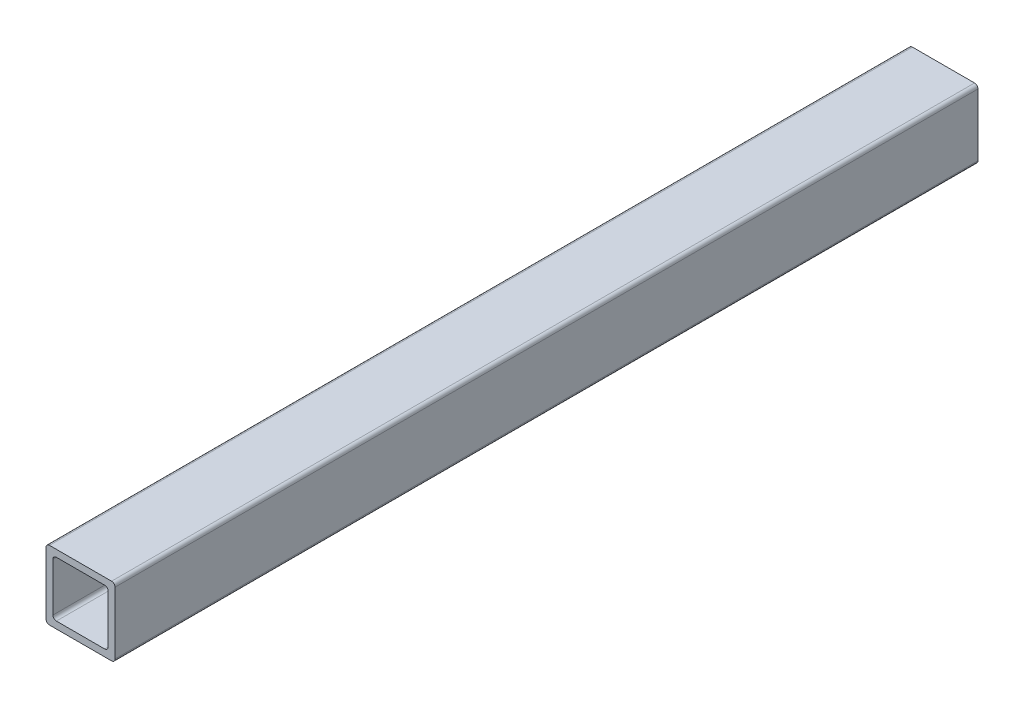
ISO-10303-21;
HEADER;
FILE_DESCRIPTION(('STEP AP214'),'2;1');
FILE_NAME('part.step','',(''),(''),'','','');
FILE_SCHEMA(('AUTOMOTIVE_DESIGN { 1 0 10303 214 1 1 1 1 }'));
ENDSEC;
DATA;
#1=APPLICATION_CONTEXT('core data for automotive mechanical design processes');
#2=APPLICATION_PROTOCOL_DEFINITION('international standard','automotive_design',2000,#1);
#3=PRODUCT_CONTEXT('',#1,'mechanical');
#4=PRODUCT('Part','Part','',(#3));
#5=PRODUCT_RELATED_PRODUCT_CATEGORY('part','',(#4));
#6=PRODUCT_DEFINITION_FORMATION('','',#4);
#7=PRODUCT_DEFINITION_CONTEXT('part definition',#1,'design');
#8=PRODUCT_DEFINITION('design','',#6,#7);
#9=PRODUCT_DEFINITION_SHAPE('','',#8);
#10=(LENGTH_UNIT() NAMED_UNIT(*) SI_UNIT(.MILLI.,.METRE.));
#11=(NAMED_UNIT(*) PLANE_ANGLE_UNIT() SI_UNIT($,.RADIAN.));
#12=(NAMED_UNIT(*) SI_UNIT($,.STERADIAN.) SOLID_ANGLE_UNIT());
#13=UNCERTAINTY_MEASURE_WITH_UNIT(LENGTH_MEASURE(1.E-05),#10,'distance_accuracy_value','');
#14=(GEOMETRIC_REPRESENTATION_CONTEXT(3) GLOBAL_UNCERTAINTY_ASSIGNED_CONTEXT((#13)) GLOBAL_UNIT_ASSIGNED_CONTEXT((#10,
#11,#12)) REPRESENTATION_CONTEXT('',''));
#15=CARTESIAN_POINT('',(0.,0.,0.));
#16=DIRECTION('',(0.,0.,1.));
#17=DIRECTION('',(1.,0.,0.));
#18=AXIS2_PLACEMENT_3D('',#15,#16,#17);
#19=CARTESIAN_POINT('',(2.,2.,499.999999999999));
#20=DIRECTION('',(0.,0.,-1.));
#21=DIRECTION('',(-1.,0.,0.));
#22=AXIS2_PLACEMENT_3D('',#19,#20,#21);
#23=PLANE('',#22);
#24=CARTESIAN_POINT('',(2.,2.,499.999999999999));
#25=DIRECTION('',(0.,0.,1.));
#26=DIRECTION('',(-1.,0.,0.));
#27=AXIS2_PLACEMENT_3D('',#24,#25,#26);
#28=CIRCLE('',#27,2.);
#29=CARTESIAN_POINT('',(0.,2.00000000000001,499.999999999999));
#30=VERTEX_POINT('',#29);
#31=CARTESIAN_POINT('',(2.00000000000001,0.,499.999999999999));
#32=VERTEX_POINT('',#31);
#33=EDGE_CURVE('E211',#30,#32,#28,.T.);
#34=ORIENTED_EDGE('',*,*,#33,.T.);
#35=DIRECTION('',(1.,0.,0.));
#36=VECTOR('',#35,1.);
#37=CARTESIAN_POINT('',(2.00000000000001,0.,499.999999999999));
#38=LINE('',#37,#36);
#39=CARTESIAN_POINT('',(38.,0.,499.999999999999));
#40=VERTEX_POINT('',#39);
#41=EDGE_CURVE('E214',#32,#40,#38,.T.);
#42=ORIENTED_EDGE('',*,*,#41,.T.);
#43=CARTESIAN_POINT('',(38.,2.,499.999999999999));
#44=DIRECTION('',(0.,0.,1.));
#45=DIRECTION('',(-1.,0.,0.));
#46=AXIS2_PLACEMENT_3D('',#43,#44,#45);
#47=CIRCLE('',#46,2.);
#48=CARTESIAN_POINT('',(40.,2.00000000000001,499.999999999999));
#49=VERTEX_POINT('',#48);
#50=EDGE_CURVE('E217',#40,#49,#47,.T.);
#51=ORIENTED_EDGE('',*,*,#50,.T.);
#52=DIRECTION('',(0.,1.,0.));
#53=VECTOR('',#52,1.);
#54=CARTESIAN_POINT('',(40.,2.00000000000001,499.999999999999));
#55=LINE('',#54,#53);
#56=CARTESIAN_POINT('',(40.,38.,499.999999999999));
#57=VERTEX_POINT('',#56);
#58=EDGE_CURVE('E219',#49,#57,#55,.T.);
#59=ORIENTED_EDGE('',*,*,#58,.T.);
#60=CARTESIAN_POINT('',(38.,38.,499.999999999999));
#61=DIRECTION('',(0.,0.,1.));
#62=DIRECTION('',(-1.,0.,0.));
#63=AXIS2_PLACEMENT_3D('',#60,#61,#62);
#64=CIRCLE('',#63,2.);
#65=CARTESIAN_POINT('',(38.,40.,499.999999999999));
#66=VERTEX_POINT('',#65);
#67=EDGE_CURVE('E221',#57,#66,#64,.T.);
#68=ORIENTED_EDGE('',*,*,#67,.T.);
#69=DIRECTION('',(-1.,0.,0.));
#70=VECTOR('',#69,1.);
#71=CARTESIAN_POINT('',(2.00000000000001,40.,499.999999999999));
#72=LINE('',#71,#70);
#73=CARTESIAN_POINT('',(2.00000000000001,40.,499.999999999999));
#74=VERTEX_POINT('',#73);
#75=EDGE_CURVE('E223',#66,#74,#72,.T.);
#76=ORIENTED_EDGE('',*,*,#75,.T.);
#77=CARTESIAN_POINT('',(2.,38.,499.999999999999));
#78=DIRECTION('',(0.,0.,1.));
#79=DIRECTION('',(-1.,0.,0.));
#80=AXIS2_PLACEMENT_3D('',#77,#78,#79);
#81=CIRCLE('',#80,2.);
#82=CARTESIAN_POINT('',(0.,38.,499.999999999999));
#83=VERTEX_POINT('',#82);
#84=EDGE_CURVE('E225',#74,#83,#81,.T.);
#85=ORIENTED_EDGE('',*,*,#84,.T.);
#86=DIRECTION('',(0.,-1.,0.));
#87=VECTOR('',#86,1.);
#88=CARTESIAN_POINT('',(0.,2.00000000000001,499.999999999999));
#89=LINE('',#88,#87);
#90=EDGE_CURVE('E227',#83,#30,#89,.T.);
#91=ORIENTED_EDGE('',*,*,#90,.T.);
#92=EDGE_LOOP('',(#34,#42,#51,#59,#68,#76,#85,#91));
#93=FACE_BOUND('',#92,.T.);
#94=CARTESIAN_POINT('',(34.,6.,499.999999999999));
#95=DIRECTION('',(0.,0.,1.));
#96=DIRECTION('',(1.,0.,0.));
#97=AXIS2_PLACEMENT_3D('',#94,#95,#96);
#98=CIRCLE('',#97,2.);
#99=CARTESIAN_POINT('',(34.,4.,499.999999999999));
#100=VERTEX_POINT('',#99);
#101=CARTESIAN_POINT('',(36.,6.00000000000001,499.999999999999));
#102=VERTEX_POINT('',#101);
#103=EDGE_CURVE('E146',#100,#102,#98,.T.);
#104=ORIENTED_EDGE('',*,*,#103,.F.);
#105=DIRECTION('',(1.,0.,0.));
#106=VECTOR('',#105,1.);
#107=CARTESIAN_POINT('',(6.00000000000001,4.,499.999999999999));
#108=LINE('',#107,#106);
#109=CARTESIAN_POINT('',(6.00000000000001,4.,499.999999999999));
#110=VERTEX_POINT('',#109);
#111=EDGE_CURVE('E179',#110,#100,#108,.T.);
#112=ORIENTED_EDGE('',*,*,#111,.F.);
#113=CARTESIAN_POINT('',(6.,6.,499.999999999999));
#114=DIRECTION('',(0.,0.,1.));
#115=DIRECTION('',(1.,0.,0.));
#116=AXIS2_PLACEMENT_3D('',#113,#114,#115);
#117=CIRCLE('',#116,2.);
#118=CARTESIAN_POINT('',(4.,6.00000000000001,499.999999999999));
#119=VERTEX_POINT('',#118);
#120=EDGE_CURVE('E177',#119,#110,#117,.T.);
#121=ORIENTED_EDGE('',*,*,#120,.F.);
#122=DIRECTION('',(0.,-1.,0.));
#123=VECTOR('',#122,1.);
#124=CARTESIAN_POINT('',(4.,6.00000000000001,499.999999999999));
#125=LINE('',#124,#123);
#126=CARTESIAN_POINT('',(4.,34.,499.999999999999));
#127=VERTEX_POINT('',#126);
#128=EDGE_CURVE('E175',#127,#119,#125,.T.);
#129=ORIENTED_EDGE('',*,*,#128,.F.);
#130=CARTESIAN_POINT('',(6.,34.,499.999999999999));
#131=DIRECTION('',(0.,0.,1.));
#132=DIRECTION('',(1.,0.,0.));
#133=AXIS2_PLACEMENT_3D('',#130,#131,#132);
#134=CIRCLE('',#133,2.);
#135=CARTESIAN_POINT('',(6.00000000000001,36.,499.999999999999));
#136=VERTEX_POINT('',#135);
#137=EDGE_CURVE('E173',#136,#127,#134,.T.);
#138=ORIENTED_EDGE('',*,*,#137,.F.);
#139=DIRECTION('',(-1.,0.,0.));
#140=VECTOR('',#139,1.);
#141=CARTESIAN_POINT('',(6.00000000000001,36.,499.999999999999));
#142=LINE('',#141,#140);
#143=CARTESIAN_POINT('',(34.,36.,499.999999999999));
#144=VERTEX_POINT('',#143);
#145=EDGE_CURVE('E169',#144,#136,#142,.T.);
#146=ORIENTED_EDGE('',*,*,#145,.F.);
#147=CARTESIAN_POINT('',(34.,34.,499.999999999999));
#148=DIRECTION('',(0.,0.,1.));
#149=DIRECTION('',(1.,0.,0.));
#150=AXIS2_PLACEMENT_3D('',#147,#148,#149);
#151=CIRCLE('',#150,2.);
#152=CARTESIAN_POINT('',(36.,34.,499.999999999999));
#153=VERTEX_POINT('',#152);
#154=EDGE_CURVE('E167',#153,#144,#151,.T.);
#155=ORIENTED_EDGE('',*,*,#154,.F.);
#156=DIRECTION('',(0.,1.,0.));
#157=VECTOR('',#156,1.);
#158=CARTESIAN_POINT('',(36.,6.00000000000001,499.999999999999));
#159=LINE('',#158,#157);
#160=EDGE_CURVE('E154',#102,#153,#159,.T.);
#161=ORIENTED_EDGE('',*,*,#160,.F.);
#162=EDGE_LOOP('',(#104,#112,#121,#129,#138,#146,#155,#161));
#163=FACE_BOUND('',#162,.T.);
#164=ADVANCED_FACE('F33',(#93,#163),#23,.F.);
#165=CARTESIAN_POINT('',(2.,2.,0.));
#166=DIRECTION('',(0.,0.,-1.));
#167=DIRECTION('',(-1.,0.,0.));
#168=AXIS2_PLACEMENT_3D('',#165,#166,#167);
#169=PLANE('',#168);
#170=CARTESIAN_POINT('',(2.,2.,0.));
#171=DIRECTION('',(0.,0.,1.));
#172=DIRECTION('',(-1.,0.,0.));
#173=AXIS2_PLACEMENT_3D('',#170,#171,#172);
#174=CIRCLE('',#173,2.);
#175=CARTESIAN_POINT('',(0.,2.00000000000001,0.));
#176=VERTEX_POINT('',#175);
#177=CARTESIAN_POINT('',(2.00000000000001,0.,0.));
#178=VERTEX_POINT('',#177);
#179=EDGE_CURVE('E162',#176,#178,#174,.T.);
#180=ORIENTED_EDGE('',*,*,#179,.F.);
#181=DIRECTION('',(0.,-1.,0.));
#182=VECTOR('',#181,1.);
#183=CARTESIAN_POINT('',(0.,2.00000000000001,0.));
#184=LINE('',#183,#182);
#185=CARTESIAN_POINT('',(0.,38.,0.));
#186=VERTEX_POINT('',#185);
#187=EDGE_CURVE('E215',#186,#176,#184,.T.);
#188=ORIENTED_EDGE('',*,*,#187,.F.);
#189=CARTESIAN_POINT('',(2.,38.,0.));
#190=DIRECTION('',(0.,0.,1.));
#191=DIRECTION('',(-1.,0.,0.));
#192=AXIS2_PLACEMENT_3D('',#189,#190,#191);
#193=CIRCLE('',#192,2.);
#194=CARTESIAN_POINT('',(2.00000000000001,40.,0.));
#195=VERTEX_POINT('',#194);
#196=EDGE_CURVE('E242',#195,#186,#193,.T.);
#197=ORIENTED_EDGE('',*,*,#196,.F.);
#198=DIRECTION('',(-1.,0.,0.));
#199=VECTOR('',#198,1.);
#200=CARTESIAN_POINT('',(2.00000000000001,40.,0.));
#201=LINE('',#200,#199);
#202=CARTESIAN_POINT('',(38.,40.,0.));
#203=VERTEX_POINT('',#202);
#204=EDGE_CURVE('E240',#203,#195,#201,.T.);
#205=ORIENTED_EDGE('',*,*,#204,.F.);
#206=CARTESIAN_POINT('',(38.,38.,0.));
#207=DIRECTION('',(0.,0.,1.));
#208=DIRECTION('',(-1.,0.,0.));
#209=AXIS2_PLACEMENT_3D('',#206,#207,#208);
#210=CIRCLE('',#209,2.);
#211=CARTESIAN_POINT('',(40.,38.,0.));
#212=VERTEX_POINT('',#211);
#213=EDGE_CURVE('E238',#212,#203,#210,.T.);
#214=ORIENTED_EDGE('',*,*,#213,.F.);
#215=DIRECTION('',(0.,1.,0.));
#216=VECTOR('',#215,1.);
#217=CARTESIAN_POINT('',(40.,2.00000000000001,0.));
#218=LINE('',#217,#216);
#219=CARTESIAN_POINT('',(40.,2.00000000000001,0.));
#220=VERTEX_POINT('',#219);
#221=EDGE_CURVE('E236',#220,#212,#218,.T.);
#222=ORIENTED_EDGE('',*,*,#221,.F.);
#223=CARTESIAN_POINT('',(38.,2.,0.));
#224=DIRECTION('',(0.,0.,1.));
#225=DIRECTION('',(-1.,0.,0.));
#226=AXIS2_PLACEMENT_3D('',#223,#224,#225);
#227=CIRCLE('',#226,2.);
#228=CARTESIAN_POINT('',(38.,0.,0.));
#229=VERTEX_POINT('',#228);
#230=EDGE_CURVE('E234',#229,#220,#227,.T.);
#231=ORIENTED_EDGE('',*,*,#230,.F.);
#232=DIRECTION('',(1.,0.,0.));
#233=VECTOR('',#232,1.);
#234=CARTESIAN_POINT('',(2.00000000000001,0.,0.));
#235=LINE('',#234,#233);
#236=EDGE_CURVE('E232',#178,#229,#235,.T.);
#237=ORIENTED_EDGE('',*,*,#236,.F.);
#238=EDGE_LOOP('',(#180,#188,#197,#205,#214,#222,#231,#237));
#239=FACE_BOUND('',#238,.T.);
#240=DIRECTION('',(1.,0.,0.));
#241=VECTOR('',#240,1.);
#242=CARTESIAN_POINT('',(6.00000000000001,4.,0.));
#243=LINE('',#242,#241);
#244=CARTESIAN_POINT('',(6.00000000000001,4.,0.));
#245=VERTEX_POINT('',#244);
#246=CARTESIAN_POINT('',(34.,4.,0.));
#247=VERTEX_POINT('',#246);
#248=EDGE_CURVE('E155',#245,#247,#243,.T.);
#249=ORIENTED_EDGE('',*,*,#248,.T.);
#250=CARTESIAN_POINT('',(34.,6.,0.));
#251=DIRECTION('',(0.,0.,1.));
#252=DIRECTION('',(1.,0.,0.));
#253=AXIS2_PLACEMENT_3D('',#250,#251,#252);
#254=CIRCLE('',#253,2.);
#255=CARTESIAN_POINT('',(36.,6.00000000000001,0.));
#256=VERTEX_POINT('',#255);
#257=EDGE_CURVE('E56',#247,#256,#254,.T.);
#258=ORIENTED_EDGE('',*,*,#257,.T.);
#259=DIRECTION('',(0.,1.,0.));
#260=VECTOR('',#259,1.);
#261=CARTESIAN_POINT('',(36.,6.00000000000001,0.));
#262=LINE('',#261,#260);
#263=CARTESIAN_POINT('',(36.,34.,0.));
#264=VERTEX_POINT('',#263);
#265=EDGE_CURVE('E161',#256,#264,#262,.T.);
#266=ORIENTED_EDGE('',*,*,#265,.T.);
#267=CARTESIAN_POINT('',(34.,34.,0.));
#268=DIRECTION('',(0.,0.,1.));
#269=DIRECTION('',(1.,0.,0.));
#270=AXIS2_PLACEMENT_3D('',#267,#268,#269);
#271=CIRCLE('',#270,2.);
#272=CARTESIAN_POINT('',(34.,36.,0.));
#273=VERTEX_POINT('',#272);
#274=EDGE_CURVE('E183',#264,#273,#271,.T.);
#275=ORIENTED_EDGE('',*,*,#274,.T.);
#276=DIRECTION('',(-1.,0.,0.));
#277=VECTOR('',#276,1.);
#278=CARTESIAN_POINT('',(6.00000000000001,36.,0.));
#279=LINE('',#278,#277);
#280=CARTESIAN_POINT('',(6.00000000000001,36.,0.));
#281=VERTEX_POINT('',#280);
#282=EDGE_CURVE('E186',#273,#281,#279,.T.);
#283=ORIENTED_EDGE('',*,*,#282,.T.);
#284=CARTESIAN_POINT('',(6.,34.,0.));
#285=DIRECTION('',(0.,0.,1.));
#286=DIRECTION('',(1.,0.,0.));
#287=AXIS2_PLACEMENT_3D('',#284,#285,#286);
#288=CIRCLE('',#287,2.);
#289=CARTESIAN_POINT('',(4.,34.,0.));
#290=VERTEX_POINT('',#289);
#291=EDGE_CURVE('E189',#281,#290,#288,.T.);
#292=ORIENTED_EDGE('',*,*,#291,.T.);
#293=DIRECTION('',(0.,-1.,0.));
#294=VECTOR('',#293,1.);
#295=CARTESIAN_POINT('',(4.,6.00000000000001,0.));
#296=LINE('',#295,#294);
#297=CARTESIAN_POINT('',(4.,6.00000000000001,0.));
#298=VERTEX_POINT('',#297);
#299=EDGE_CURVE('E192',#290,#298,#296,.T.);
#300=ORIENTED_EDGE('',*,*,#299,.T.);
#301=CARTESIAN_POINT('',(6.,6.,0.));
#302=DIRECTION('',(0.,0.,1.));
#303=DIRECTION('',(1.,0.,0.));
#304=AXIS2_PLACEMENT_3D('',#301,#302,#303);
#305=CIRCLE('',#304,2.);
#306=EDGE_CURVE('E195',#298,#245,#305,.T.);
#307=ORIENTED_EDGE('',*,*,#306,.T.);
#308=EDGE_LOOP('',(#249,#258,#266,#275,#283,#292,#300,#307));
#309=FACE_BOUND('',#308,.T.);
#310=ADVANCED_FACE('F272',(#239,#309),#169,.T.);
#311=CARTESIAN_POINT('',(2.,2.,499.999999999999));
#312=DIRECTION('',(0.,0.,-1.));
#313=DIRECTION('',(-1.,0.,0.));
#314=AXIS2_PLACEMENT_3D('',#311,#312,#313);
#315=CYLINDRICAL_SURFACE('',#314,2.);
#316=ORIENTED_EDGE('',*,*,#179,.T.);
#317=DIRECTION('',(0.,0.,-1.));
#318=VECTOR('',#317,1.);
#319=CARTESIAN_POINT('',(2.00000000000001,0.,499.999999999999));
#320=LINE('',#319,#318);
#321=EDGE_CURVE('E11',#32,#178,#320,.T.);
#322=ORIENTED_EDGE('',*,*,#321,.F.);
#323=ORIENTED_EDGE('',*,*,#33,.F.);
#324=DIRECTION('',(0.,0.,-1.));
#325=VECTOR('',#324,1.);
#326=CARTESIAN_POINT('',(0.,2.00000000000001,499.999999999999));
#327=LINE('',#326,#325);
#328=EDGE_CURVE('E229',#30,#176,#327,.T.);
#329=ORIENTED_EDGE('',*,*,#328,.T.);
#330=EDGE_LOOP('',(#316,#322,#323,#329));
#331=FACE_BOUND('',#330,.T.);
#332=ADVANCED_FACE('F35',(#331),#315,.T.);
#333=CARTESIAN_POINT('',(2.00000000000001,0.,499.999999999999));
#334=DIRECTION('',(0.,1.,0.));
#335=DIRECTION('',(0.,0.,1.));
#336=AXIS2_PLACEMENT_3D('',#333,#334,#335);
#337=PLANE('',#336);
#338=ORIENTED_EDGE('',*,*,#236,.T.);
#339=DIRECTION('',(0.,0.,-1.));
#340=VECTOR('',#339,1.);
#341=CARTESIAN_POINT('',(38.,0.,499.999999999999));
#342=LINE('',#341,#340);
#343=EDGE_CURVE('E41',#40,#229,#342,.T.);
#344=ORIENTED_EDGE('',*,*,#343,.F.);
#345=ORIENTED_EDGE('',*,*,#41,.F.);
#346=ORIENTED_EDGE('',*,*,#321,.T.);
#347=EDGE_LOOP('',(#338,#344,#345,#346));
#348=FACE_BOUND('',#347,.T.);
#349=ADVANCED_FACE('F289',(#348),#337,.F.);
#350=CARTESIAN_POINT('',(38.,2.,499.999999999999));
#351=DIRECTION('',(0.,0.,-1.));
#352=DIRECTION('',(-1.,0.,0.));
#353=AXIS2_PLACEMENT_3D('',#350,#351,#352);
#354=CYLINDRICAL_SURFACE('',#353,2.);
#355=ORIENTED_EDGE('',*,*,#230,.T.);
#356=DIRECTION('',(0.,0.,-1.));
#357=VECTOR('',#356,1.);
#358=CARTESIAN_POINT('',(40.,2.00000000000001,499.999999999999));
#359=LINE('',#358,#357);
#360=EDGE_CURVE('E259',#49,#220,#359,.T.);
#361=ORIENTED_EDGE('',*,*,#360,.F.);
#362=ORIENTED_EDGE('',*,*,#50,.F.);
#363=ORIENTED_EDGE('',*,*,#343,.T.);
#364=EDGE_LOOP('',(#355,#361,#362,#363));
#365=FACE_BOUND('',#364,.T.);
#366=ADVANCED_FACE('F266',(#365),#354,.T.);
#367=CARTESIAN_POINT('',(40.,2.00000000000001,499.999999999999));
#368=DIRECTION('',(-1.,0.,0.));
#369=DIRECTION('',(0.,0.,1.));
#370=AXIS2_PLACEMENT_3D('',#367,#368,#369);
#371=PLANE('',#370);
#372=ORIENTED_EDGE('',*,*,#221,.T.);
#373=DIRECTION('',(0.,0.,-1.));
#374=VECTOR('',#373,1.);
#375=CARTESIAN_POINT('',(40.,38.,499.999999999999));
#376=LINE('',#375,#374);
#377=EDGE_CURVE('E256',#57,#212,#376,.T.);
#378=ORIENTED_EDGE('',*,*,#377,.F.);
#379=ORIENTED_EDGE('',*,*,#58,.F.);
#380=ORIENTED_EDGE('',*,*,#360,.T.);
#381=EDGE_LOOP('',(#372,#378,#379,#380));
#382=FACE_BOUND('',#381,.T.);
#383=ADVANCED_FACE('F278',(#382),#371,.F.);
#384=CARTESIAN_POINT('',(38.,38.,499.999999999999));
#385=DIRECTION('',(0.,0.,-1.));
#386=DIRECTION('',(-1.,0.,0.));
#387=AXIS2_PLACEMENT_3D('',#384,#385,#386);
#388=CYLINDRICAL_SURFACE('',#387,2.);
#389=ORIENTED_EDGE('',*,*,#213,.T.);
#390=DIRECTION('',(0.,0.,-1.));
#391=VECTOR('',#390,1.);
#392=CARTESIAN_POINT('',(38.,40.,499.999999999999));
#393=LINE('',#392,#391);
#394=EDGE_CURVE('E253',#66,#203,#393,.T.);
#395=ORIENTED_EDGE('',*,*,#394,.F.);
#396=ORIENTED_EDGE('',*,*,#67,.F.);
#397=ORIENTED_EDGE('',*,*,#377,.T.);
#398=EDGE_LOOP('',(#389,#395,#396,#397));
#399=FACE_BOUND('',#398,.T.);
#400=ADVANCED_FACE('F282',(#399),#388,.T.);
#401=CARTESIAN_POINT('',(2.00000000000001,40.,499.999999999999));
#402=DIRECTION('',(0.,-1.,0.));
#403=DIRECTION('',(0.,0.,-1.));
#404=AXIS2_PLACEMENT_3D('',#401,#402,#403);
#405=PLANE('',#404);
#406=ORIENTED_EDGE('',*,*,#204,.T.);
#407=DIRECTION('',(0.,0.,-1.));
#408=VECTOR('',#407,1.);
#409=CARTESIAN_POINT('',(2.00000000000001,40.,499.999999999999));
#410=LINE('',#409,#408);
#411=EDGE_CURVE('E250',#74,#195,#410,.T.);
#412=ORIENTED_EDGE('',*,*,#411,.F.);
#413=ORIENTED_EDGE('',*,*,#75,.F.);
#414=ORIENTED_EDGE('',*,*,#394,.T.);
#415=EDGE_LOOP('',(#406,#412,#413,#414));
#416=FACE_BOUND('',#415,.T.);
#417=ADVANCED_FACE('F302',(#416),#405,.F.);
#418=CARTESIAN_POINT('',(2.,38.,499.999999999999));
#419=DIRECTION('',(0.,0.,-1.));
#420=DIRECTION('',(-1.,0.,0.));
#421=AXIS2_PLACEMENT_3D('',#418,#419,#420);
#422=CYLINDRICAL_SURFACE('',#421,2.);
#423=ORIENTED_EDGE('',*,*,#196,.T.);
#424=DIRECTION('',(0.,0.,-1.));
#425=VECTOR('',#424,1.);
#426=CARTESIAN_POINT('',(0.,38.,499.999999999999));
#427=LINE('',#426,#425);
#428=EDGE_CURVE('E247',#83,#186,#427,.T.);
#429=ORIENTED_EDGE('',*,*,#428,.F.);
#430=ORIENTED_EDGE('',*,*,#84,.F.);
#431=ORIENTED_EDGE('',*,*,#411,.T.);
#432=EDGE_LOOP('',(#423,#429,#430,#431));
#433=FACE_BOUND('',#432,.T.);
#434=ADVANCED_FACE('F300',(#433),#422,.T.);
#435=CARTESIAN_POINT('',(0.,2.00000000000001,499.999999999999));
#436=DIRECTION('',(1.,0.,0.));
#437=DIRECTION('',(0.,0.,-1.));
#438=AXIS2_PLACEMENT_3D('',#435,#436,#437);
#439=PLANE('',#438);
#440=ORIENTED_EDGE('',*,*,#187,.T.);
#441=ORIENTED_EDGE('',*,*,#328,.F.);
#442=ORIENTED_EDGE('',*,*,#90,.F.);
#443=ORIENTED_EDGE('',*,*,#428,.T.);
#444=EDGE_LOOP('',(#440,#441,#442,#443));
#445=FACE_BOUND('',#444,.T.);
#446=ADVANCED_FACE('F295',(#445),#439,.F.);
#447=CARTESIAN_POINT('',(34.,6.,499.999999999999));
#448=DIRECTION('',(0.,0.,-1.));
#449=DIRECTION('',(-1.,0.,0.));
#450=AXIS2_PLACEMENT_3D('',#447,#448,#449);
#451=CYLINDRICAL_SURFACE('',#450,2.);
#452=ORIENTED_EDGE('',*,*,#257,.F.);
#453=DIRECTION('',(0.,0.,-1.));
#454=VECTOR('',#453,1.);
#455=CARTESIAN_POINT('',(34.,4.,499.999999999999));
#456=LINE('',#455,#454);
#457=EDGE_CURVE('E150',#100,#247,#456,.T.);
#458=ORIENTED_EDGE('',*,*,#457,.F.);
#459=ORIENTED_EDGE('',*,*,#103,.T.);
#460=DIRECTION('',(0.,0.,-1.));
#461=VECTOR('',#460,1.);
#462=CARTESIAN_POINT('',(36.,6.00000000000001,499.999999999999));
#463=LINE('',#462,#461);
#464=EDGE_CURVE('E149',#102,#256,#463,.T.);
#465=ORIENTED_EDGE('',*,*,#464,.T.);
#466=EDGE_LOOP('',(#452,#458,#459,#465));
#467=FACE_BOUND('',#466,.T.);
#468=ADVANCED_FACE('F148',(#467),#451,.F.);
#469=CARTESIAN_POINT('',(36.,6.00000000000001,499.999999999999));
#470=DIRECTION('',(-1.,0.,0.));
#471=DIRECTION('',(0.,0.,1.));
#472=AXIS2_PLACEMENT_3D('',#469,#470,#471);
#473=PLANE('',#472);
#474=ORIENTED_EDGE('',*,*,#265,.F.);
#475=ORIENTED_EDGE('',*,*,#464,.F.);
#476=ORIENTED_EDGE('',*,*,#160,.T.);
#477=DIRECTION('',(0.,0.,-1.));
#478=VECTOR('',#477,1.);
#479=CARTESIAN_POINT('',(36.,34.,499.999999999999));
#480=LINE('',#479,#478);
#481=EDGE_CURVE('E163',#153,#264,#480,.T.);
#482=ORIENTED_EDGE('',*,*,#481,.T.);
#483=EDGE_LOOP('',(#474,#475,#476,#482));
#484=FACE_BOUND('',#483,.T.);
#485=ADVANCED_FACE('F158',(#484),#473,.T.);
#486=CARTESIAN_POINT('',(34.,34.,499.999999999999));
#487=DIRECTION('',(0.,0.,-1.));
#488=DIRECTION('',(-1.,0.,0.));
#489=AXIS2_PLACEMENT_3D('',#486,#487,#488);
#490=CYLINDRICAL_SURFACE('',#489,2.);
#491=ORIENTED_EDGE('',*,*,#274,.F.);
#492=ORIENTED_EDGE('',*,*,#481,.F.);
#493=ORIENTED_EDGE('',*,*,#154,.T.);
#494=DIRECTION('',(0.,0.,-1.));
#495=VECTOR('',#494,1.);
#496=CARTESIAN_POINT('',(34.,36.,499.999999999999));
#497=LINE('',#496,#495);
#498=EDGE_CURVE('E208',#144,#273,#497,.T.);
#499=ORIENTED_EDGE('',*,*,#498,.T.);
#500=EDGE_LOOP('',(#491,#492,#493,#499));
#501=FACE_BOUND('',#500,.T.);
#502=ADVANCED_FACE('F327',(#501),#490,.F.);
#503=CARTESIAN_POINT('',(6.00000000000001,36.,499.999999999999));
#504=DIRECTION('',(0.,-1.,0.));
#505=DIRECTION('',(0.,0.,-1.));
#506=AXIS2_PLACEMENT_3D('',#503,#504,#505);
#507=PLANE('',#506);
#508=ORIENTED_EDGE('',*,*,#282,.F.);
#509=ORIENTED_EDGE('',*,*,#498,.F.);
#510=ORIENTED_EDGE('',*,*,#145,.T.);
#511=DIRECTION('',(0.,0.,-1.));
#512=VECTOR('',#511,1.);
#513=CARTESIAN_POINT('',(6.00000000000001,36.,499.999999999999));
#514=LINE('',#513,#512);
#515=EDGE_CURVE('E206',#136,#281,#514,.T.);
#516=ORIENTED_EDGE('',*,*,#515,.T.);
#517=EDGE_LOOP('',(#508,#509,#510,#516));
#518=FACE_BOUND('',#517,.T.);
#519=ADVANCED_FACE('F331',(#518),#507,.T.);
#520=CARTESIAN_POINT('',(6.,34.,499.999999999999));
#521=DIRECTION('',(0.,0.,-1.));
#522=DIRECTION('',(-1.,0.,0.));
#523=AXIS2_PLACEMENT_3D('',#520,#521,#522);
#524=CYLINDRICAL_SURFACE('',#523,2.);
#525=ORIENTED_EDGE('',*,*,#291,.F.);
#526=ORIENTED_EDGE('',*,*,#515,.F.);
#527=ORIENTED_EDGE('',*,*,#137,.T.);
#528=DIRECTION('',(0.,0.,-1.));
#529=VECTOR('',#528,1.);
#530=CARTESIAN_POINT('',(4.,34.,499.999999999999));
#531=LINE('',#530,#529);
#532=EDGE_CURVE('E204',#127,#290,#531,.T.);
#533=ORIENTED_EDGE('',*,*,#532,.T.);
#534=EDGE_LOOP('',(#525,#526,#527,#533));
#535=FACE_BOUND('',#534,.T.);
#536=ADVANCED_FACE('F337',(#535),#524,.F.);
#537=CARTESIAN_POINT('',(4.,6.00000000000001,499.999999999999));
#538=DIRECTION('',(1.,0.,0.));
#539=DIRECTION('',(0.,0.,-1.));
#540=AXIS2_PLACEMENT_3D('',#537,#538,#539);
#541=PLANE('',#540);
#542=ORIENTED_EDGE('',*,*,#299,.F.);
#543=ORIENTED_EDGE('',*,*,#532,.F.);
#544=ORIENTED_EDGE('',*,*,#128,.T.);
#545=DIRECTION('',(0.,0.,-1.));
#546=VECTOR('',#545,1.);
#547=CARTESIAN_POINT('',(4.,6.00000000000001,499.999999999999));
#548=LINE('',#547,#546);
#549=EDGE_CURVE('E202',#119,#298,#548,.T.);
#550=ORIENTED_EDGE('',*,*,#549,.T.);
#551=EDGE_LOOP('',(#542,#543,#544,#550));
#552=FACE_BOUND('',#551,.T.);
#553=ADVANCED_FACE('F341',(#552),#541,.T.);
#554=CARTESIAN_POINT('',(6.,6.,499.999999999999));
#555=DIRECTION('',(0.,0.,-1.));
#556=DIRECTION('',(-1.,0.,0.));
#557=AXIS2_PLACEMENT_3D('',#554,#555,#556);
#558=CYLINDRICAL_SURFACE('',#557,2.);
#559=ORIENTED_EDGE('',*,*,#306,.F.);
#560=ORIENTED_EDGE('',*,*,#549,.F.);
#561=ORIENTED_EDGE('',*,*,#120,.T.);
#562=DIRECTION('',(0.,0.,-1.));
#563=VECTOR('',#562,1.);
#564=CARTESIAN_POINT('',(6.00000000000001,4.,499.999999999999));
#565=LINE('',#564,#563);
#566=EDGE_CURVE('E48',#110,#245,#565,.T.);
#567=ORIENTED_EDGE('',*,*,#566,.T.);
#568=EDGE_LOOP('',(#559,#560,#561,#567));
#569=FACE_BOUND('',#568,.T.);
#570=ADVANCED_FACE('F345',(#569),#558,.F.);
#571=CARTESIAN_POINT('',(6.00000000000001,4.,499.999999999999));
#572=DIRECTION('',(0.,1.,0.));
#573=DIRECTION('',(0.,0.,1.));
#574=AXIS2_PLACEMENT_3D('',#571,#572,#573);
#575=PLANE('',#574);
#576=ORIENTED_EDGE('',*,*,#248,.F.);
#577=ORIENTED_EDGE('',*,*,#566,.F.);
#578=ORIENTED_EDGE('',*,*,#111,.T.);
#579=ORIENTED_EDGE('',*,*,#457,.T.);
#580=EDGE_LOOP('',(#576,#577,#578,#579));
#581=FACE_BOUND('',#580,.T.);
#582=ADVANCED_FACE('F349',(#581),#575,.T.);
#583=CLOSED_SHELL('',(#164,#310,#332,#349,#366,#383,#400,#417,#434,#446,#468,#485,#502,#519,
#536,#553,#570,#582));
#584=MANIFOLD_SOLID_BREP('B2',#583);
#585=ADVANCED_BREP_SHAPE_REPRESENTATION('',(#18,#584),#14);
#586=SHAPE_DEFINITION_REPRESENTATION(#9,#585);
ENDSEC;
END-ISO-10303-21;
